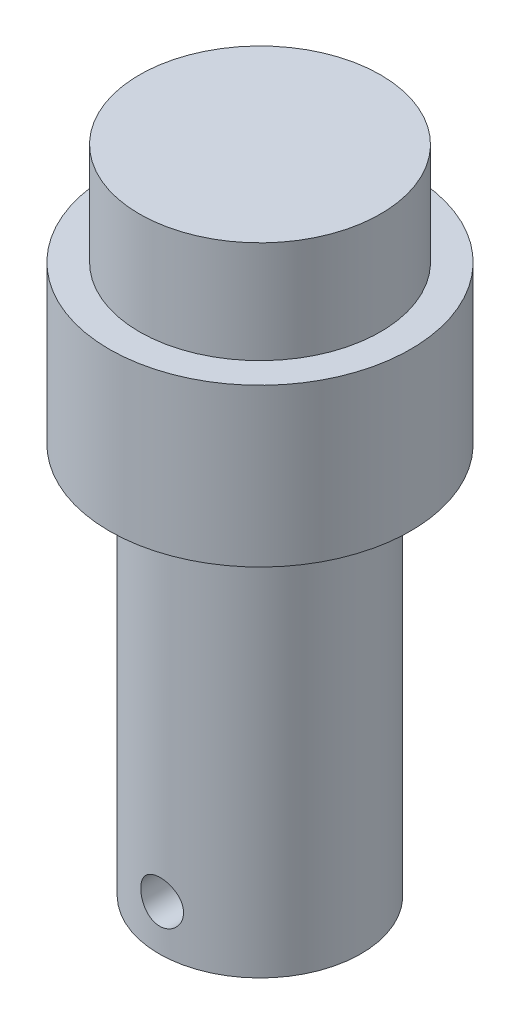
ISO-10303-21;
HEADER;
FILE_DESCRIPTION(('STEP AP214'),'2;1');
FILE_NAME('part.step','',(''),(''),'','','');
FILE_SCHEMA(('AUTOMOTIVE_DESIGN { 1 0 10303 214 1 1 1 1 }'));
ENDSEC;
DATA;
#1=APPLICATION_CONTEXT('core data for automotive mechanical design processes');
#2=APPLICATION_PROTOCOL_DEFINITION('international standard','automotive_design',2000,#1);
#3=PRODUCT_CONTEXT('',#1,'mechanical');
#4=PRODUCT('Part','Part','',(#3));
#5=PRODUCT_RELATED_PRODUCT_CATEGORY('part','',(#4));
#6=PRODUCT_DEFINITION_FORMATION('','',#4);
#7=PRODUCT_DEFINITION_CONTEXT('part definition',#1,'design');
#8=PRODUCT_DEFINITION('design','',#6,#7);
#9=PRODUCT_DEFINITION_SHAPE('','',#8);
#10=(LENGTH_UNIT() NAMED_UNIT(*) SI_UNIT(.MILLI.,.METRE.));
#11=(NAMED_UNIT(*) PLANE_ANGLE_UNIT() SI_UNIT($,.RADIAN.));
#12=(NAMED_UNIT(*) SI_UNIT($,.STERADIAN.) SOLID_ANGLE_UNIT());
#13=UNCERTAINTY_MEASURE_WITH_UNIT(LENGTH_MEASURE(1.E-05),#10,'distance_accuracy_value','');
#14=(GEOMETRIC_REPRESENTATION_CONTEXT(3) GLOBAL_UNCERTAINTY_ASSIGNED_CONTEXT((#13)) GLOBAL_UNIT_ASSIGNED_CONTEXT((#10,
#11,#12)) REPRESENTATION_CONTEXT('',''));
#15=CARTESIAN_POINT('',(0.,0.,0.));
#16=DIRECTION('',(0.,0.,1.));
#17=DIRECTION('',(1.,0.,0.));
#18=AXIS2_PLACEMENT_3D('',#15,#16,#17);
#19=CARTESIAN_POINT('',(0.,29.2608,0.));
#20=DIRECTION('',(0.,-1.,0.));
#21=DIRECTION('',(0.,0.,-1.));
#22=AXIS2_PLACEMENT_3D('',#19,#20,#21);
#23=CYLINDRICAL_SURFACE('',#22,7.5565);
#24=CARTESIAN_POINT('',(0.,4.9890850263178,-7.5565));
#25=CARTESIAN_POINT('',(-0.0881302665516909,4.98541249219338,-7.55649839908637));
#26=CARTESIAN_POINT('',(-0.175992744714434,4.9743745510477,-7.55494257248275));
#27=CARTESIAN_POINT('',(-0.348614768725653,4.93789012468596,-7.54894950824275));
#28=CARTESIAN_POINT('',(-0.433371870337387,4.91243253861315,-7.54451005027726));
#29=CARTESIAN_POINT('',(-0.597275321486443,4.84792169849227,-7.53330595091646));
#30=CARTESIAN_POINT('',(-0.676427274749817,4.80888226056731,-7.52654367249575));
#31=CARTESIAN_POINT('',(-0.827071522039202,4.71834236577525,-7.51148347096546));
#32=CARTESIAN_POINT('',(-0.898564184785687,4.6668425091456,-7.50318562183121));
#33=CARTESIAN_POINT('',(-1.03290509581415,4.55203904709444,-7.48588360841699));
#34=CARTESIAN_POINT('',(-1.09562743388999,4.4885892535059,-7.47687159684738));
#35=CARTESIAN_POINT('',(-1.20960931209136,4.35205578960372,-7.45928093821527));
#36=CARTESIAN_POINT('',(-1.26086809024315,4.2789714794043,-7.45070231998942));
#37=CARTESIAN_POINT('',(-1.35084114896491,4.12452208957567,-7.43491974002923));
#38=CARTESIAN_POINT('',(-1.389453122591,4.04309614966995,-7.42772717419115));
#39=CARTESIAN_POINT('',(-1.45239826621148,3.87473831347291,-7.41567707472115));
#40=CARTESIAN_POINT('',(-1.47673305831642,3.78780704391683,-7.41081927583464));
#41=CARTESIAN_POINT('',(-1.510095091146,3.61228209390645,-7.40409302806836));
#42=CARTESIAN_POINT('',(-1.51934433875328,3.52373228688576,-7.40218124764877));
#43=CARTESIAN_POINT('',(-1.52292779464249,3.34632305305214,-7.40144497345909));
#44=CARTESIAN_POINT('',(-1.51726331423231,3.25746365414654,-7.40262020825937));
#45=CARTESIAN_POINT('',(-1.49138629265019,3.08321950003112,-7.40787595864922));
#46=CARTESIAN_POINT('',(-1.47137191855091,2.99780397814633,-7.4119168917409));
#47=CARTESIAN_POINT('',(-1.41763393057988,2.83155664841248,-7.4223816833546));
#48=CARTESIAN_POINT('',(-1.38390940360034,2.75072514627168,-7.42880570058953));
#49=CARTESIAN_POINT('',(-1.30333992884666,2.59505369225249,-7.44336495593883));
#50=CARTESIAN_POINT('',(-1.25637023877083,2.52027985669077,-7.45151627084515));
#51=CARTESIAN_POINT('',(-1.15075582325796,2.37958052479303,-7.46855454410578));
#52=CARTESIAN_POINT('',(-1.092109762423,2.31365604198096,-7.47744158653546));
#53=CARTESIAN_POINT('',(-0.96358786193199,2.19133735434669,-7.49509584754039));
#54=CARTESIAN_POINT('',(-0.893534483241499,2.13512880257281,-7.50385829536825));
#55=CARTESIAN_POINT('',(-0.74485553947854,2.03525163741253,-7.520070855692));
#56=CARTESIAN_POINT('',(-0.666230129517661,1.991582797171,-7.5275209919279));
#57=CARTESIAN_POINT('',(-0.502800050277772,1.91817663852283,-7.54019739952984));
#58=CARTESIAN_POINT('',(-0.418012199531982,1.88840293397584,-7.54542947582835));
#59=CARTESIAN_POINT('',(-0.244513748710836,1.84355617310872,-7.55304158488291));
#60=CARTESIAN_POINT('',(-0.155803678085183,1.82848113895021,-7.55542200136531));
#61=CARTESIAN_POINT('',(0.0212504963857858,1.81365253195789,-7.55697910349875));
#62=CARTESIAN_POINT('',(0.109570762091833,1.81361942187162,-7.55621450719801));
#63=CARTESIAN_POINT('',(0.284915597192903,1.82816130250332,-7.55163608487561));
#64=CARTESIAN_POINT('',(0.371940210167635,1.8427358007579,-7.54782236164942));
#65=CARTESIAN_POINT('',(0.541754514852726,1.88589434720757,-7.53753249342312));
#66=CARTESIAN_POINT('',(0.624564943039837,1.91440056931277,-7.53107117060293));
#67=CARTESIAN_POINT('',(0.784236346933611,1.98452503220105,-7.51612285114467));
#68=CARTESIAN_POINT('',(0.861096716702632,2.02614460622953,-7.50763564855499));
#69=CARTESIAN_POINT('',(1.00808745718409,2.12212527679458,-7.48932808574045));
#70=CARTESIAN_POINT('',(1.07808384613326,2.17668773891766,-7.47948781126215));
#71=CARTESIAN_POINT('',(1.20802045849076,2.29667759634804,-7.45960506990973));
#72=CARTESIAN_POINT('',(1.26795955942903,2.36210620278062,-7.4495625806068));
#73=CARTESIAN_POINT('',(1.37698226108911,2.50315463967933,-7.43019053174077));
#74=CARTESIAN_POINT('',(1.42589046986059,2.5789120138013,-7.42087385142398));
#75=CARTESIAN_POINT('',(1.51026016283261,2.73777417773579,-7.40416538863195));
#76=CARTESIAN_POINT('',(1.54572270752189,2.82087838744958,-7.3967734543622));
#77=CARTESIAN_POINT('',(1.60180166225924,2.99119851512143,-7.38483198271009));
#78=CARTESIAN_POINT('',(1.62256745337069,3.0783631718274,-7.38025390937982));
#79=CARTESIAN_POINT('',(1.64915583874751,3.25504607627338,-7.37435878389032));
#80=CARTESIAN_POINT('',(1.65498066224588,3.34456397089013,-7.37304124525147));
#81=CARTESIAN_POINT('',(1.65153216283361,3.52139390409078,-7.37381408242538));
#82=CARTESIAN_POINT('',(1.64257500249582,3.60871261238782,-7.37583309607885));
#83=CARTESIAN_POINT('',(1.61045315484399,3.78056478786409,-7.38291267807313));
#84=CARTESIAN_POINT('',(1.58728830915863,3.86509822398517,-7.38797328031814));
#85=CARTESIAN_POINT('',(1.5274569806368,4.02909082449868,-7.40057400371428));
#86=CARTESIAN_POINT('',(1.49078285853478,4.10854708794633,-7.40811552752574));
#87=CARTESIAN_POINT('',(1.40500048464852,4.26024340004153,-7.42486151132554));
#88=CARTESIAN_POINT('',(1.35589088730019,4.33248266660317,-7.43406615123826));
#89=CARTESIAN_POINT('',(1.24540304875745,4.46933436692248,-7.45337956345312));
#90=CARTESIAN_POINT('',(1.18378655106926,4.53375239996508,-7.4635033781819));
#91=CARTESIAN_POINT('',(1.05061228805425,4.65142660040092,-7.48341037764097));
#92=CARTESIAN_POINT('',(0.979052314294188,4.70468028159611,-7.49319348609551));
#93=CARTESIAN_POINT('',(0.827114668910324,4.79902595769491,-7.51149012754239));
#94=CARTESIAN_POINT('',(0.746652678100122,4.83998506789761,-7.5199893273916));
#95=CARTESIAN_POINT('',(0.57981595457145,4.90771195054426,-7.53468602659381));
#96=CARTESIAN_POINT('',(0.493446533425538,4.93449228702564,-7.54088556225235));
#97=CARTESIAN_POINT('',(0.339004484060317,4.96829427194567,-7.54918579145796));
#98=CARTESIAN_POINT('',(0.271656418795661,4.97855560368614,-7.55191957886067));
#99=CARTESIAN_POINT('',(0.136152412513961,4.99036758349019,-7.55557726731439));
#100=CARTESIAN_POINT('',(0.067996501413177,4.99191855311344,-7.55650123517754));
#101=CARTESIAN_POINT('',(0.,4.9890850263178,-7.5565));
#102=B_SPLINE_CURVE_WITH_KNOTS('',3,(#24,#25,#26,#27,#28,#29,#30,#31,#32,#33,#34,#35,#36,#37,
#38,#39,#40,#41,#42,#43,#44,#45,#46,#47,#48,#49,#50,#51,#52,#53,#54,#55,#56,#57,#58,#59,#60,#61,
#62,#63,#64,#65,#66,#67,#68,#69,#70,#71,#72,#73,#74,#75,#76,#77,#78,#79,#80,#81,#82,#83,#84,#85,
#86,#87,#88,#89,#90,#91,#92,#93,#94,#95,#96,#97,#98,#99,#100,#101),.UNSPECIFIED.,.T.,.F.,(4,2,2,
2,2,2,2,2,2,2,2,2,2,2,2,2,2,2,2,2,2,2,2,2,2,2,2,2,2,2,2,2,2,2,2,2,2,2,4),(0.,0.264370876630532,
0.528945554378518,0.79325187701234,1.0575454701401,1.32531134625832,1.59309501527536,
1.86299430266107,2.13286291933589,2.39872294874939,2.66455960287316,2.92679415520654,
3.18904617544489,3.45385566078891,3.71869544915993,3.98814046886903,4.25758061375799,
4.52631118143581,4.795005584005,5.05870639495465,5.32239831611043,5.58463374077053,
5.84689583573255,6.11354208483181,6.38021807392014,6.65087466269856,6.92150989976094,
7.18935322043529,7.45715657583256,7.71930594551134,7.98145823738985,8.24375900006542,
8.50608815678392,8.77398469429868,9.04194082667625,9.3126966897396,9.58321222846055,
9.78719389160464,9.99116802432631),.UNSPECIFIED.);
#103=CARTESIAN_POINT('',(0.,4.9890850263178,-7.5565));
#104=VERTEX_POINT('',#103);
#105=EDGE_CURVE('E36',#104,#104,#102,.T.);
#106=ORIENTED_EDGE('',*,*,#105,.T.);
#107=EDGE_LOOP('',(#106));
#108=FACE_BOUND('',#107,.T.);
#109=CARTESIAN_POINT('',(1.65354,3.40295925312073,7.37336407065323));
#110=CARTESIAN_POINT('',(1.65353684624317,3.31495955314514,7.37336587750825));
#111=CARTESIAN_POINT('',(1.64619776382212,3.22692127463862,7.37502243786989));
#112=CARTESIAN_POINT('',(1.61706654692714,3.05334542018152,7.38146342514937));
#113=CARTESIAN_POINT('',(1.59526341354644,2.96780979905027,7.38625023236311));
#114=CARTESIAN_POINT('',(1.53792386332951,2.80177858399448,7.39840081194056));
#115=CARTESIAN_POINT('',(1.50240260589436,2.72127754024139,7.40576173889242));
#116=CARTESIAN_POINT('',(1.41868115404115,2.5673792789722,7.42225359253281));
#117=CARTESIAN_POINT('',(1.37048135733095,2.49398183872487,7.43138446369833));
#118=CARTESIAN_POINT('',(1.26191193721403,2.35513822289741,7.4505937306364));
#119=CARTESIAN_POINT('',(1.20136968425993,2.28982870936925,7.46068434302061));
#120=CARTESIAN_POINT('',(1.07020978816027,2.17020680582915,7.4806240234554));
#121=CARTESIAN_POINT('',(0.999591299883082,2.11589533918995,7.49047307116376));
#122=CARTESIAN_POINT('',(0.84929930098893,2.0192204153089,7.50900602213078));
#123=CARTESIAN_POINT('',(0.769532105025895,1.97699957882703,7.51767543071283));
#124=CARTESIAN_POINT('',(0.603822610592366,1.90661468575636,7.53279518746539));
#125=CARTESIAN_POINT('',(0.517880928549268,1.87844922817898,7.53924575678173));
#126=CARTESIAN_POINT('',(0.343549423397087,1.83737628488795,7.54918386308293));
#127=CARTESIAN_POINT('',(0.255211636814126,1.82425798196311,7.55271214238153));
#128=CARTESIAN_POINT('',(0.0775220755047883,1.81300732644103,7.55662461598194));
#129=CARTESIAN_POINT('',(-0.0118295823928449,1.81487326436912,7.55700916892516));
#130=CARTESIAN_POINT('',(-0.187403291174101,1.83337853847599,7.55467761138897));
#131=CARTESIAN_POINT('',(-0.273652722086464,1.84976629395045,7.55201407892598));
#132=CARTESIAN_POINT('',(-0.442163959844766,1.89646330378509,7.54402432454623));
#133=CARTESIAN_POINT('',(-0.524425631763578,1.9267730288367,7.53869801260234));
#134=CARTESIAN_POINT('',(-0.683133803270358,2.00060567381087,7.52598152112348));
#135=CARTESIAN_POINT('',(-0.759547738569386,2.04419667808666,7.5185807230862));
#136=CARTESIAN_POINT('',(-0.904066365552617,2.14330480924786,7.50257626019639));
#137=CARTESIAN_POINT('',(-0.972170052181838,2.19882337643501,7.49397245011911));
#138=CARTESIAN_POINT('',(-1.09947033955435,2.32143459847373,7.47636745164832));
#139=CARTESIAN_POINT('',(-1.15847726417044,2.38872369233141,7.46736184561081));
#140=CARTESIAN_POINT('',(-1.26441069004017,2.53231716457475,7.45015748455528));
#141=CARTESIAN_POINT('',(-1.31133685207458,2.60862179602253,7.4419587521977));
#142=CARTESIAN_POINT('',(-1.39190556445865,2.76846086005841,7.42731323800308));
#143=CARTESIAN_POINT('',(-1.42549977505138,2.85202028716967,7.4208728575567));
#144=CARTESIAN_POINT('',(-1.47811811965924,3.02375667463094,7.41057252510215));
#145=CARTESIAN_POINT('',(-1.49714417802104,3.11193302347471,7.40671223229178));
#146=CARTESIAN_POINT('',(-1.5198139122465,3.2887862119285,7.40209369076452));
#147=CARTESIAN_POINT('',(-1.52371494618351,3.37742873748112,7.4012835495219));
#148=CARTESIAN_POINT('',(-1.51671941837571,3.5540987125559,7.40272022989553));
#149=CARTESIAN_POINT('',(-1.50582372324564,3.64212619779624,7.4049668724821));
#150=CARTESIAN_POINT('',(-1.46977262525175,3.8141564134035,7.41220544620171));
#151=CARTESIAN_POINT('',(-1.4447618669177,3.89819073798449,7.41716951517496));
#152=CARTESIAN_POINT('',(-1.38134525714625,4.06087734194995,7.42924040547247));
#153=CARTESIAN_POINT('',(-1.34293826093028,4.13952916068384,7.43634740991473));
#154=CARTESIAN_POINT('',(-1.25322698908812,4.29036723898904,7.45199350335046));
#155=CARTESIAN_POINT('',(-1.20175835566012,4.36245386921033,7.46055034190184));
#156=CARTESIAN_POINT('',(-1.08759732844905,4.49706494576491,7.47804462392057));
#157=CARTESIAN_POINT('',(-1.02490376446273,4.5595883938715,7.48698210699615));
#158=CARTESIAN_POINT('',(-0.888914617724298,4.67427710550183,7.5043510228112));
#159=CARTESIAN_POINT('',(-0.81547106443077,4.726268636743,7.51277258166491));
#160=CARTESIAN_POINT('',(-0.660734850637428,4.81717455715627,7.52795828819534));
#161=CARTESIAN_POINT('',(-0.579442597756267,4.8560896249788,7.53472252188002));
#162=CARTESIAN_POINT('',(-0.4118835964102,4.91943894457489,7.54572978596352));
#163=CARTESIAN_POINT('',(-0.325655531551144,4.94397237884937,7.54999008521649));
#164=CARTESIAN_POINT('',(-0.150212792796275,4.9781976954619,7.55551614067027));
#165=CARTESIAN_POINT('',(-0.0609985042149788,4.98789148508373,7.55678228171038));
#166=CARTESIAN_POINT('',(0.116127206573053,4.99209478179192,7.55611725570635));
#167=CARTESIAN_POINT('',(0.204032430266659,4.98688014944725,7.554244437705));
#168=CARTESIAN_POINT('',(0.377663840811845,4.96204173076495,7.54755672799996));
#169=CARTESIAN_POINT('',(0.46339004116526,4.94241803373242,7.54274185453069));
#170=CARTESIAN_POINT('',(0.630179601923005,4.8894156518626,7.53064112442739));
#171=CARTESIAN_POINT('',(0.711248037072824,4.85605227348284,7.52335801907863));
#172=CARTESIAN_POINT('',(0.866668595213404,4.77655713080934,7.50704277747602));
#173=CARTESIAN_POINT('',(0.941020072292304,4.73042414030207,7.49801047327879));
#174=CARTESIAN_POINT('',(1.08239824164371,4.62568397392261,7.47892343592616));
#175=CARTESIAN_POINT('',(1.1492618844684,4.56685958219458,7.46885273670743));
#176=CARTESIAN_POINT('',(1.27226269865637,4.43884720958147,7.44888796683078));
#177=CARTESIAN_POINT('',(1.3283972998057,4.36965675249956,7.43899393900902));
#178=CARTESIAN_POINT('',(1.42897021498234,4.22189653149108,7.42033625842323));
#179=CARTESIAN_POINT('',(1.47326440497539,4.14322674390344,7.41158714286115));
#180=CARTESIAN_POINT('',(1.54792500893951,3.97938148111198,7.39635611612491));
#181=CARTESIAN_POINT('',(1.57830384579013,3.89421188815583,7.38987218394906));
#182=CARTESIAN_POINT('',(1.61857382338989,3.7412386239092,7.38113930333655));
#183=CARTESIAN_POINT('',(1.63166154476495,3.67429515252866,7.37824187149804));
#184=CARTESIAN_POINT('',(1.64914565929424,3.53922854806102,7.37435359830376));
#185=CARTESIAN_POINT('',(1.65354244224231,3.47110546801832,7.37336267144016));
#186=CARTESIAN_POINT('',(1.65354,3.40295925312073,7.37336407065323));
#187=B_SPLINE_CURVE_WITH_KNOTS('',3,(#109,#110,#111,#112,#113,#114,#115,#116,#117,#118,#119,
#120,#121,#122,#123,#124,#125,#126,#127,#128,#129,#130,#131,#132,#133,#134,#135,#136,#137,#138,
#139,#140,#141,#142,#143,#144,#145,#146,#147,#148,#149,#150,#151,#152,#153,#154,#155,#156,#157,
#158,#159,#160,#161,#162,#163,#164,#165,#166,#167,#168,#169,#170,#171,#172,#173,#174,#175,#176,
#177,#178,#179,#180,#181,#182,#183,#184,#185,#186),.UNSPECIFIED.,.T.,.F.,(4,2,2,2,2,2,2,2,2,2,2,
2,2,2,2,2,2,2,2,2,2,2,2,2,2,2,2,2,2,2,2,2,2,2,2,2,2,2,4),(0.,0.263749125424023,
0.527699044003541,0.791358111896047,1.05500891016234,1.32263727251356,1.59028809506807,
1.8609770451255,2.13163900850968,2.39846069276643,2.66525193714736,2.92750964222308,
3.18977621468914,3.45341054499321,3.7170767281263,3.98565731368608,4.25424543997512,
4.52379872052926,4.79331638891521,5.05822745038928,5.32312299722327,5.58535206317674,
5.84760354346726,6.11333452913806,6.37909323351189,6.64893138200986,6.91875552411645,
7.18669624797307,7.45460253152289,7.7175838257304,7.98056349003534,8.24325097546861,
8.50596369446098,8.77359111705734,9.04128257146366,9.31209764460024,9.58267047511995,
9.78692470282944,9.9911697694056),.UNSPECIFIED.);
#188=CARTESIAN_POINT('',(1.65354,3.40295925312073,7.37336407065323));
#189=VERTEX_POINT('',#188);
#190=EDGE_CURVE('E61',#189,#189,#187,.T.);
#191=ORIENTED_EDGE('',*,*,#190,.T.);
#192=EDGE_LOOP('',(#191));
#193=FACE_BOUND('',#192,.T.);
#194=CARTESIAN_POINT('',(0.,29.2608,0.));
#195=DIRECTION('',(0.,1.,0.));
#196=DIRECTION('',(0.,0.,1.));
#197=AXIS2_PLACEMENT_3D('',#194,#195,#196);
#198=CIRCLE('',#197,7.5565);
#199=CARTESIAN_POINT('',(0.,29.2608,7.5565));
#200=VERTEX_POINT('',#199);
#201=EDGE_CURVE('E44',#200,#200,#198,.T.);
#202=ORIENTED_EDGE('',*,*,#201,.F.);
#203=EDGE_LOOP('',(#202));
#204=FACE_BOUND('',#203,.T.);
#205=CARTESIAN_POINT('',(0.,0.,0.));
#206=DIRECTION('',(0.,1.,0.));
#207=DIRECTION('',(0.,0.,1.));
#208=AXIS2_PLACEMENT_3D('',#205,#206,#207);
#209=CIRCLE('',#208,7.5565);
#210=CARTESIAN_POINT('',(0.,0.,7.5565));
#211=VERTEX_POINT('',#210);
#212=EDGE_CURVE('E49',#211,#211,#209,.T.);
#213=ORIENTED_EDGE('',*,*,#212,.T.);
#214=EDGE_LOOP('',(#213));
#215=FACE_BOUND('',#214,.T.);
#216=ADVANCED_FACE('F32',(#108,#193,#204,#215),#23,.T.);
#217=CARTESIAN_POINT('',(0.,0.,0.));
#218=DIRECTION('',(0.,1.,0.));
#219=DIRECTION('',(0.,0.,1.));
#220=AXIS2_PLACEMENT_3D('',#217,#218,#219);
#221=PLANE('',#220);
#222=ORIENTED_EDGE('',*,*,#212,.F.);
#223=EDGE_LOOP('',(#222));
#224=FACE_BOUND('',#223,.T.);
#225=ADVANCED_FACE('F90',(#224),#221,.F.);
#226=CARTESIAN_POINT('',(0.,41.04132,0.));
#227=DIRECTION('',(0.,-1.,0.));
#228=DIRECTION('',(0.,0.,-1.));
#229=AXIS2_PLACEMENT_3D('',#226,#227,#228);
#230=CYLINDRICAL_SURFACE('',#229,11.2776);
#231=CARTESIAN_POINT('',(0.,41.04132,0.));
#232=DIRECTION('',(0.,1.,0.));
#233=DIRECTION('',(0.,0.,1.));
#234=AXIS2_PLACEMENT_3D('',#231,#232,#233);
#235=CIRCLE('',#234,11.2776);
#236=CARTESIAN_POINT('',(0.,41.04132,-11.2776));
#237=VERTEX_POINT('',#236);
#238=EDGE_CURVE('E54',#237,#237,#235,.T.);
#239=CARTESIAN_POINT('',(0.,29.2608,0.));
#240=DIRECTION('',(0.,1.,0.));
#241=DIRECTION('',(0.,0.,1.));
#242=AXIS2_PLACEMENT_3D('',#239,#240,#241);
#243=CIRCLE('',#242,11.2776);
#244=CARTESIAN_POINT('',(0.,29.2608,-11.2776));
#245=VERTEX_POINT('',#244);
#246=EDGE_CURVE('E57',#245,#245,#243,.T.);
#247=CARTESIAN_POINT('',(0.,41.04132,-11.2776));
#248=CARTESIAN_POINT('',(0.,40.91860625,-11.2776));
#249=CARTESIAN_POINT('',(0.,40.7958925,-11.2776));
#250=CARTESIAN_POINT('',(0.,40.550465,-11.2776));
#251=CARTESIAN_POINT('',(0.,40.42775125,-11.2776));
#252=CARTESIAN_POINT('',(0.,40.18232375,-11.2776));
#253=CARTESIAN_POINT('',(0.,40.05961,-11.2776));
#254=CARTESIAN_POINT('',(0.,39.8141825,-11.2776));
#255=CARTESIAN_POINT('',(0.,39.69146875,-11.2776));
#256=CARTESIAN_POINT('',(0.,39.44604125,-11.2776));
#257=CARTESIAN_POINT('',(0.,39.3233275,-11.2776));
#258=CARTESIAN_POINT('',(0.,39.0779,-11.2776));
#259=CARTESIAN_POINT('',(0.,38.95518625,-11.2776));
#260=CARTESIAN_POINT('',(0.,38.70975875,-11.2776));
#261=CARTESIAN_POINT('',(0.,38.587045,-11.2776));
#262=CARTESIAN_POINT('',(0.,38.3416175,-11.2776));
#263=CARTESIAN_POINT('',(0.,38.21890375,-11.2776));
#264=CARTESIAN_POINT('',(0.,37.97347625,-11.2776));
#265=CARTESIAN_POINT('',(0.,37.8507625,-11.2776));
#266=CARTESIAN_POINT('',(0.,37.605335,-11.2776));
#267=CARTESIAN_POINT('',(0.,37.48262125,-11.2776));
#268=CARTESIAN_POINT('',(0.,37.23719375,-11.2776));
#269=CARTESIAN_POINT('',(0.,37.11448,-11.2776));
#270=CARTESIAN_POINT('',(0.,36.8690525,-11.2776));
#271=CARTESIAN_POINT('',(0.,36.74633875,-11.2776));
#272=CARTESIAN_POINT('',(0.,36.50091125,-11.2776));
#273=CARTESIAN_POINT('',(0.,36.3781975,-11.2776));
#274=CARTESIAN_POINT('',(0.,36.13277,-11.2776));
#275=CARTESIAN_POINT('',(0.,36.01005625,-11.2776));
#276=CARTESIAN_POINT('',(0.,35.76462875,-11.2776));
#277=CARTESIAN_POINT('',(0.,35.641915,-11.2776));
#278=CARTESIAN_POINT('',(0.,35.3964875,-11.2776));
#279=CARTESIAN_POINT('',(0.,35.27377375,-11.2776));
#280=CARTESIAN_POINT('',(0.,35.02834625,-11.2776));
#281=CARTESIAN_POINT('',(0.,34.9056325,-11.2776));
#282=CARTESIAN_POINT('',(0.,34.660205,-11.2776));
#283=CARTESIAN_POINT('',(0.,34.53749125,-11.2776));
#284=CARTESIAN_POINT('',(0.,34.29206375,-11.2776));
#285=CARTESIAN_POINT('',(0.,34.16935,-11.2776));
#286=CARTESIAN_POINT('',(0.,33.9239225,-11.2776));
#287=CARTESIAN_POINT('',(0.,33.80120875,-11.2776));
#288=CARTESIAN_POINT('',(0.,33.55578125,-11.2776));
#289=CARTESIAN_POINT('',(0.,33.4330675,-11.2776));
#290=CARTESIAN_POINT('',(0.,33.18764,-11.2776));
#291=CARTESIAN_POINT('',(0.,33.06492625,-11.2776));
#292=CARTESIAN_POINT('',(0.,32.81949875,-11.2776));
#293=CARTESIAN_POINT('',(0.,32.696785,-11.2776));
#294=CARTESIAN_POINT('',(0.,32.4513575,-11.2776));
#295=CARTESIAN_POINT('',(0.,32.32864375,-11.2776));
#296=CARTESIAN_POINT('',(0.,32.08321625,-11.2776));
#297=CARTESIAN_POINT('',(0.,31.9605025,-11.2776));
#298=CARTESIAN_POINT('',(0.,31.715075,-11.2776));
#299=CARTESIAN_POINT('',(0.,31.59236125,-11.2776));
#300=CARTESIAN_POINT('',(0.,31.34693375,-11.2776));
#301=CARTESIAN_POINT('',(0.,31.22422,-11.2776));
#302=CARTESIAN_POINT('',(0.,30.9787925,-11.2776));
#303=CARTESIAN_POINT('',(0.,30.85607875,-11.2776));
#304=CARTESIAN_POINT('',(0.,30.61065125,-11.2776));
#305=CARTESIAN_POINT('',(0.,30.4879375,-11.2776));
#306=CARTESIAN_POINT('',(0.,30.24251,-11.2776));
#307=CARTESIAN_POINT('',(0.,30.11979625,-11.2776));
#308=CARTESIAN_POINT('',(0.,29.87436875,-11.2776));
#309=CARTESIAN_POINT('',(0.,29.751655,-11.2776));
#310=CARTESIAN_POINT('',(0.,29.5062275,-11.2776));
#311=CARTESIAN_POINT('',(0.,29.38351375,-11.2776));
#312=CARTESIAN_POINT('',(0.,29.2608,-11.2776));
#313=B_SPLINE_CURVE_WITH_KNOTS('',3,(#247,#248,#249,#250,#251,#252,#253,#254,#255,#256,#257,
#258,#259,#260,#261,#262,#263,#264,#265,#266,#267,#268,#269,#270,#271,#272,#273,#274,#275,#276,
#277,#278,#279,#280,#281,#282,#283,#284,#285,#286,#287,#288,#289,#290,#291,#292,#293,#294,#295,
#296,#297,#298,#299,#300,#301,#302,#303,#304,#305,#306,#307,#308,#309,#310,#311,#312),
.UNSPECIFIED.,.F.,.F.,(4,2,2,2,2,2,2,2,2,2,2,2,2,2,2,2,2,2,2,2,2,2,2,2,2,2,2,2,2,2,2,2,4),(0.,
0.368141249999995,0.736282499999998,1.10442374999999,1.472565,1.84070625,2.20884749999999,
2.57698875,2.94513,3.31327124999999,3.68141249999999,4.04955375,4.41769499999999,
4.78583624999999,5.1539775,5.52211874999999,5.89025999999999,6.25840125,6.62654249999999,
6.99468374999999,7.362825,7.73096624999999,8.09910749999999,8.46724874999999,8.83538999999999,
9.20353124999999,9.57167249999999,9.93981374999999,10.307955,10.67609625,11.0442375,11.41237875,
11.78052),.UNSPECIFIED.);
#314=EDGE_CURVE('BSEAM84',#237,#245,#313,.T.);
#315=ORIENTED_EDGE('',*,*,#238,.F.);
#316=ORIENTED_EDGE('',*,*,#246,.T.);
#317=ORIENTED_EDGE('',*,*,#314,.T.);
#318=ORIENTED_EDGE('',*,*,#314,.F.);
#319=EDGE_LOOP('',(#315,#317,#316,#318));
#320=FACE_BOUND('',#319,.T.);
#321=ADVANCED_FACE('F84',(#320),#230,.T.);
#322=CARTESIAN_POINT('',(0.,41.04132,0.));
#323=DIRECTION('',(0.,1.,0.));
#324=DIRECTION('',(0.,0.,1.));
#325=AXIS2_PLACEMENT_3D('',#322,#323,#324);
#326=PLANE('',#325);
#327=CARTESIAN_POINT('',(0.,41.04132,0.));
#328=DIRECTION('',(0.,1.,0.));
#329=DIRECTION('',(0.,0.,1.));
#330=AXIS2_PLACEMENT_3D('',#327,#328,#329);
#331=CIRCLE('',#330,9.02208);
#332=CARTESIAN_POINT('',(0.,41.04132,-9.02208));
#333=VERTEX_POINT('',#332);
#334=EDGE_CURVE('E10',#333,#333,#331,.T.);
#335=ORIENTED_EDGE('',*,*,#334,.F.);
#336=EDGE_LOOP('',(#335));
#337=FACE_BOUND('',#336,.T.);
#338=ORIENTED_EDGE('',*,*,#238,.T.);
#339=EDGE_LOOP('',(#338));
#340=FACE_BOUND('',#339,.T.);
#341=ADVANCED_FACE('F81',(#337,#340),#326,.T.);
#342=CARTESIAN_POINT('',(0.,29.2608,0.));
#343=DIRECTION('',(0.,1.,0.));
#344=DIRECTION('',(0.,0.,1.));
#345=AXIS2_PLACEMENT_3D('',#342,#343,#344);
#346=PLANE('',#345);
#347=ORIENTED_EDGE('',*,*,#201,.T.);
#348=EDGE_LOOP('',(#347));
#349=FACE_BOUND('',#348,.T.);
#350=ORIENTED_EDGE('',*,*,#246,.F.);
#351=EDGE_LOOP('',(#350));
#352=FACE_BOUND('',#351,.T.);
#353=ADVANCED_FACE('F79',(#349,#352),#346,.F.);
#354=CARTESIAN_POINT('',(0.,48.67656,0.));
#355=DIRECTION('',(0.,-1.,0.));
#356=DIRECTION('',(0.,0.,-1.));
#357=AXIS2_PLACEMENT_3D('',#354,#355,#356);
#358=CYLINDRICAL_SURFACE('',#357,9.02208);
#359=CARTESIAN_POINT('',(0.,48.67656,0.));
#360=DIRECTION('',(0.,1.,0.));
#361=DIRECTION('',(0.,0.,1.));
#362=AXIS2_PLACEMENT_3D('',#359,#360,#361);
#363=CIRCLE('',#362,9.02208);
#364=CARTESIAN_POINT('',(0.,48.67656,-9.02208));
#365=VERTEX_POINT('',#364);
#366=EDGE_CURVE('E53',#365,#365,#363,.T.);
#367=CARTESIAN_POINT('',(0.,48.67656,-9.02208));
#368=CARTESIAN_POINT('',(0.,48.59702625,-9.02208));
#369=CARTESIAN_POINT('',(0.,48.5174925,-9.02208));
#370=CARTESIAN_POINT('',(0.,48.358425,-9.02208));
#371=CARTESIAN_POINT('',(0.,48.27889125,-9.02208));
#372=CARTESIAN_POINT('',(0.,48.11982375,-9.02208));
#373=CARTESIAN_POINT('',(0.,48.04029,-9.02208));
#374=CARTESIAN_POINT('',(0.,47.8812225,-9.02208));
#375=CARTESIAN_POINT('',(0.,47.80168875,-9.02208));
#376=CARTESIAN_POINT('',(0.,47.64262125,-9.02208));
#377=CARTESIAN_POINT('',(0.,47.5630875,-9.02208));
#378=CARTESIAN_POINT('',(0.,47.40402,-9.02208));
#379=CARTESIAN_POINT('',(0.,47.32448625,-9.02208));
#380=CARTESIAN_POINT('',(0.,47.16541875,-9.02208));
#381=CARTESIAN_POINT('',(0.,47.085885,-9.02208));
#382=CARTESIAN_POINT('',(0.,46.9268175,-9.02208));
#383=CARTESIAN_POINT('',(0.,46.84728375,-9.02208));
#384=CARTESIAN_POINT('',(0.,46.68821625,-9.02208));
#385=CARTESIAN_POINT('',(0.,46.6086825,-9.02208));
#386=CARTESIAN_POINT('',(0.,46.449615,-9.02208));
#387=CARTESIAN_POINT('',(0.,46.37008125,-9.02208));
#388=CARTESIAN_POINT('',(0.,46.21101375,-9.02208));
#389=CARTESIAN_POINT('',(0.,46.13148,-9.02208));
#390=CARTESIAN_POINT('',(0.,45.9724125,-9.02208));
#391=CARTESIAN_POINT('',(0.,45.89287875,-9.02208));
#392=CARTESIAN_POINT('',(0.,45.73381125,-9.02208));
#393=CARTESIAN_POINT('',(0.,45.6542775,-9.02208));
#394=CARTESIAN_POINT('',(0.,45.49521,-9.02208));
#395=CARTESIAN_POINT('',(0.,45.41567625,-9.02208));
#396=CARTESIAN_POINT('',(0.,45.25660875,-9.02208));
#397=CARTESIAN_POINT('',(0.,45.177075,-9.02208));
#398=CARTESIAN_POINT('',(0.,45.0180075,-9.02208));
#399=CARTESIAN_POINT('',(0.,44.93847375,-9.02208));
#400=CARTESIAN_POINT('',(0.,44.77940625,-9.02208));
#401=CARTESIAN_POINT('',(0.,44.6998725,-9.02208));
#402=CARTESIAN_POINT('',(0.,44.540805,-9.02208));
#403=CARTESIAN_POINT('',(0.,44.46127125,-9.02208));
#404=CARTESIAN_POINT('',(0.,44.30220375,-9.02208));
#405=CARTESIAN_POINT('',(0.,44.22267,-9.02208));
#406=CARTESIAN_POINT('',(0.,44.0636025,-9.02208));
#407=CARTESIAN_POINT('',(0.,43.98406875,-9.02208));
#408=CARTESIAN_POINT('',(0.,43.82500125,-9.02208));
#409=CARTESIAN_POINT('',(0.,43.7454675,-9.02208));
#410=CARTESIAN_POINT('',(0.,43.5864,-9.02208));
#411=CARTESIAN_POINT('',(0.,43.50686625,-9.02208));
#412=CARTESIAN_POINT('',(0.,43.34779875,-9.02208));
#413=CARTESIAN_POINT('',(0.,43.268265,-9.02208));
#414=CARTESIAN_POINT('',(0.,43.1091975,-9.02208));
#415=CARTESIAN_POINT('',(0.,43.02966375,-9.02208));
#416=CARTESIAN_POINT('',(0.,42.87059625,-9.02208));
#417=CARTESIAN_POINT('',(0.,42.7910625,-9.02208));
#418=CARTESIAN_POINT('',(0.,42.631995,-9.02208));
#419=CARTESIAN_POINT('',(0.,42.55246125,-9.02208));
#420=CARTESIAN_POINT('',(0.,42.39339375,-9.02208));
#421=CARTESIAN_POINT('',(0.,42.31386,-9.02208));
#422=CARTESIAN_POINT('',(0.,42.1547925,-9.02208));
#423=CARTESIAN_POINT('',(0.,42.07525875,-9.02208));
#424=CARTESIAN_POINT('',(0.,41.91619125,-9.02208));
#425=CARTESIAN_POINT('',(0.,41.8366575,-9.02208));
#426=CARTESIAN_POINT('',(0.,41.67759,-9.02208));
#427=CARTESIAN_POINT('',(0.,41.59805625,-9.02208));
#428=CARTESIAN_POINT('',(0.,41.43898875,-9.02208));
#429=CARTESIAN_POINT('',(0.,41.359455,-9.02208));
#430=CARTESIAN_POINT('',(0.,41.2003875,-9.02208));
#431=CARTESIAN_POINT('',(0.,41.12085375,-9.02208));
#432=CARTESIAN_POINT('',(0.,41.04132,-9.02208));
#433=B_SPLINE_CURVE_WITH_KNOTS('',3,(#367,#368,#369,#370,#371,#372,#373,#374,#375,#376,#377,
#378,#379,#380,#381,#382,#383,#384,#385,#386,#387,#388,#389,#390,#391,#392,#393,#394,#395,#396,
#397,#398,#399,#400,#401,#402,#403,#404,#405,#406,#407,#408,#409,#410,#411,#412,#413,#414,#415,
#416,#417,#418,#419,#420,#421,#422,#423,#424,#425,#426,#427,#428,#429,#430,#431,#432),
.UNSPECIFIED.,.F.,.F.,(4,2,2,2,2,2,2,2,2,2,2,2,2,2,2,2,2,2,2,2,2,2,2,2,2,2,2,2,2,2,2,2,4),(0.,
0.238601250000005,0.477202500000003,0.715803750000001,0.954405000000005,1.19300625,1.4316075,
1.67020875000001,1.90881,2.14741125,2.38601250000001,2.62461375,2.863215,3.10181625000001,
3.3404175,3.57901875,3.81762000000001,4.05622125000001,4.2948225,4.53342375,4.77202500000001,
5.01062625,5.2492275,5.48782875000001,5.72643,5.96503125,6.20363250000001,6.44223375000001,
6.680835,6.91943625000001,7.15803750000001,7.39663875,7.63524000000001),.UNSPECIFIED.);
#434=EDGE_CURVE('BSEAM75',#365,#333,#433,.T.);
#435=ORIENTED_EDGE('',*,*,#366,.F.);
#436=ORIENTED_EDGE('',*,*,#334,.T.);
#437=ORIENTED_EDGE('',*,*,#434,.T.);
#438=ORIENTED_EDGE('',*,*,#434,.F.);
#439=EDGE_LOOP('',(#435,#437,#436,#438));
#440=FACE_BOUND('',#439,.T.);
#441=ADVANCED_FACE('F75',(#440),#358,.T.);
#442=CARTESIAN_POINT('',(0.,48.67656,0.));
#443=DIRECTION('',(0.,1.,0.));
#444=DIRECTION('',(0.,0.,1.));
#445=AXIS2_PLACEMENT_3D('',#442,#443,#444);
#446=PLANE('',#445);
#447=ORIENTED_EDGE('',*,*,#366,.T.);
#448=EDGE_LOOP('',(#447));
#449=FACE_BOUND('',#448,.T.);
#450=ADVANCED_FACE('F70',(#449),#446,.T.);
#451=CARTESIAN_POINT('',(0.0660399999999998,3.40295925312073,-11.2776));
#452=DIRECTION('',(0.,0.,1.));
#453=DIRECTION('',(1.,0.,0.));
#454=AXIS2_PLACEMENT_3D('',#451,#452,#453);
#455=CYLINDRICAL_SURFACE('',#454,1.5875);
#456=ORIENTED_EDGE('',*,*,#190,.F.);
#457=EDGE_LOOP('',(#456));
#458=FACE_BOUND('',#457,.T.);
#459=ORIENTED_EDGE('',*,*,#105,.F.);
#460=EDGE_LOOP('',(#459));
#461=FACE_BOUND('',#460,.T.);
#462=ADVANCED_FACE('F66',(#458,#461),#455,.F.);
#463=CLOSED_SHELL('',(#216,#225,#321,#341,#353,#441,#450,#462));
#464=MANIFOLD_SOLID_BREP('B2',#463);
#465=ADVANCED_BREP_SHAPE_REPRESENTATION('',(#18,#464),#14);
#466=SHAPE_DEFINITION_REPRESENTATION(#9,#465);
ENDSEC;
END-ISO-10303-21;
